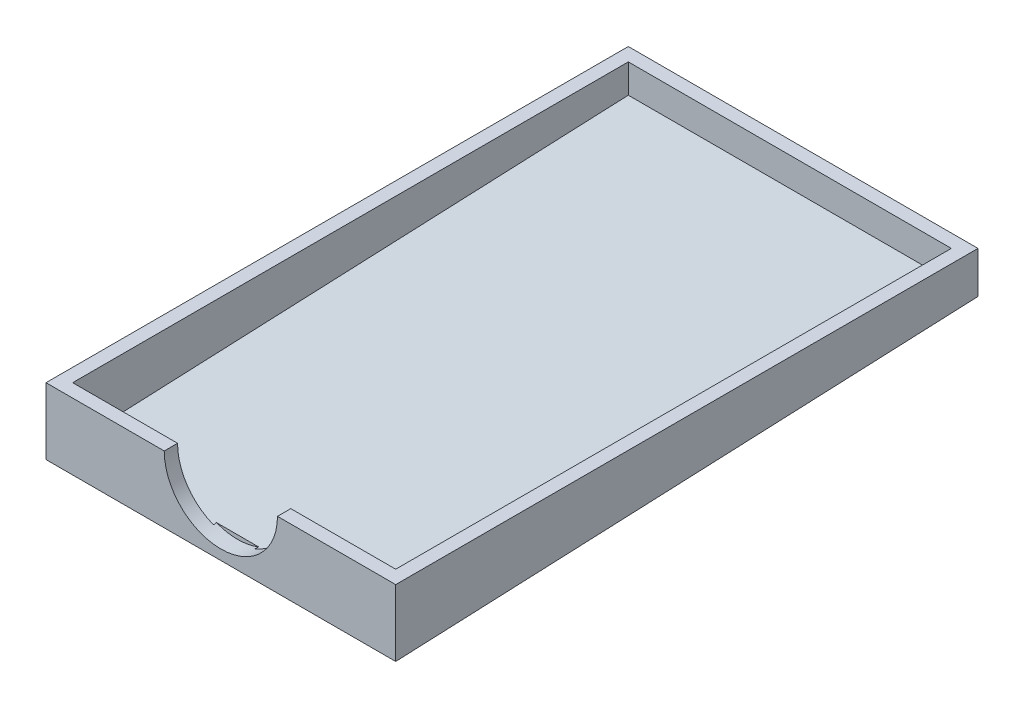
ISO-10303-21;
HEADER;
FILE_DESCRIPTION(('STEP AP214'),'2;1');
FILE_NAME('part.step','',(''),(''),'','','');
FILE_SCHEMA(('AUTOMOTIVE_DESIGN { 1 0 10303 214 1 1 1 1 }'));
ENDSEC;
DATA;
#1=APPLICATION_CONTEXT('core data for automotive mechanical design processes');
#2=APPLICATION_PROTOCOL_DEFINITION('international standard','automotive_design',2000,#1);
#3=PRODUCT_CONTEXT('',#1,'mechanical');
#4=PRODUCT('Part','Part','',(#3));
#5=PRODUCT_RELATED_PRODUCT_CATEGORY('part','',(#4));
#6=PRODUCT_DEFINITION_FORMATION('','',#4);
#7=PRODUCT_DEFINITION_CONTEXT('part definition',#1,'design');
#8=PRODUCT_DEFINITION('design','',#6,#7);
#9=PRODUCT_DEFINITION_SHAPE('','',#8);
#10=(LENGTH_UNIT() NAMED_UNIT(*) SI_UNIT(.MILLI.,.METRE.));
#11=(NAMED_UNIT(*) PLANE_ANGLE_UNIT() SI_UNIT($,.RADIAN.));
#12=(NAMED_UNIT(*) SI_UNIT($,.STERADIAN.) SOLID_ANGLE_UNIT());
#13=UNCERTAINTY_MEASURE_WITH_UNIT(LENGTH_MEASURE(1.E-05),#10,'distance_accuracy_value','');
#14=(GEOMETRIC_REPRESENTATION_CONTEXT(3) GLOBAL_UNCERTAINTY_ASSIGNED_CONTEXT((#13)) GLOBAL_UNIT_ASSIGNED_CONTEXT((#10,
#11,#12)) REPRESENTATION_CONTEXT('',''));
#15=CARTESIAN_POINT('',(0.,0.,0.));
#16=DIRECTION('',(0.,0.,1.));
#17=DIRECTION('',(1.,0.,0.));
#18=AXIS2_PLACEMENT_3D('',#15,#16,#17);
#19=CARTESIAN_POINT('',(21.,-1.5,33.3678423698117));
#20=DIRECTION('',(0.,0.,-1.));
#21=DIRECTION('',(-1.,0.,0.));
#22=AXIS2_PLACEMENT_3D('',#19,#20,#21);
#23=PLANE('',#22);
#24=CARTESIAN_POINT('',(0.,6.5,33.3678423698117));
#25=DIRECTION('',(0.,0.,-1.));
#26=DIRECTION('',(-1.,0.,0.));
#27=AXIS2_PLACEMENT_3D('',#24,#25,#26);
#28=CIRCLE('',#27,6.8);
#29=CARTESIAN_POINT('',(6.80000000000001,6.5,33.3678423698117));
#30=VERTEX_POINT('',#29);
#31=CARTESIAN_POINT('',(2.48443972282158,0.170105904229817,33.3678423698117));
#32=VERTEX_POINT('',#31);
#33=EDGE_CURVE('E239',#30,#32,#28,.T.);
#34=ORIENTED_EDGE('',*,*,#33,.F.);
#35=DIRECTION('',(-1.,0.,0.));
#36=VECTOR('',#35,1.);
#37=CARTESIAN_POINT('',(21.,6.5,33.3678423698117));
#38=LINE('',#37,#36);
#39=CARTESIAN_POINT('',(19.4,6.5,33.3678423698117));
#40=VERTEX_POINT('',#39);
#41=EDGE_CURVE('E203',#40,#30,#38,.T.);
#42=ORIENTED_EDGE('',*,*,#41,.F.);
#43=DIRECTION('',(0.,-1.,0.));
#44=VECTOR('',#43,1.);
#45=CARTESIAN_POINT('',(19.4,0.,33.3678423698117));
#46=LINE('',#45,#44);
#47=CARTESIAN_POINT('',(19.4,0.170105904229817,33.3678423698117));
#48=VERTEX_POINT('',#47);
#49=EDGE_CURVE('E217',#40,#48,#46,.T.);
#50=ORIENTED_EDGE('',*,*,#49,.T.);
#51=DIRECTION('',(-1.,0.,0.));
#52=VECTOR('',#51,1.);
#53=CARTESIAN_POINT('',(21.,0.170105904229817,33.3678423698117));
#54=LINE('',#53,#52);
#55=EDGE_CURVE('E190',#48,#32,#54,.T.);
#56=ORIENTED_EDGE('',*,*,#55,.T.);
#57=EDGE_LOOP('',(#34,#42,#50,#56));
#58=FACE_BOUND('',#57,.T.);
#59=ADVANCED_FACE('F38',(#58),#23,.T.);
#60=CARTESIAN_POINT('',(21.,6.5,34.9678423698117));
#61=DIRECTION('',(0.,-1.,0.));
#62=DIRECTION('',(0.,0.,-1.));
#63=AXIS2_PLACEMENT_3D('',#60,#61,#62);
#64=PLANE('',#63);
#65=ORIENTED_EDGE('',*,*,#41,.T.);
#66=DIRECTION('',(0.,0.,1.));
#67=VECTOR('',#66,1.);
#68=CARTESIAN_POINT('',(6.80000000000001,6.5,32.9678423698117));
#69=LINE('',#68,#67);
#70=CARTESIAN_POINT('',(6.80000000000001,6.5,34.9678423698117));
#71=VERTEX_POINT('',#70);
#72=EDGE_CURVE('E235',#30,#71,#69,.T.);
#73=ORIENTED_EDGE('',*,*,#72,.T.);
#74=DIRECTION('',(-1.,0.,0.));
#75=VECTOR('',#74,1.);
#76=CARTESIAN_POINT('',(21.,6.5,34.9678423698117));
#77=LINE('',#76,#75);
#78=CARTESIAN_POINT('',(21.,6.5,34.9678423698117));
#79=VERTEX_POINT('',#78);
#80=EDGE_CURVE('E157',#79,#71,#77,.T.);
#81=ORIENTED_EDGE('',*,*,#80,.F.);
#82=DIRECTION('',(0.,0.,1.));
#83=VECTOR('',#82,1.);
#84=CARTESIAN_POINT('',(21.,6.5,34.9678423698117));
#85=LINE('',#84,#83);
#86=CARTESIAN_POINT('',(21.,6.49999999999999,-34.9678423698117));
#87=VERTEX_POINT('',#86);
#88=EDGE_CURVE('E164',#87,#79,#85,.T.);
#89=ORIENTED_EDGE('',*,*,#88,.F.);
#90=DIRECTION('',(-1.,0.,0.));
#91=VECTOR('',#90,1.);
#92=CARTESIAN_POINT('',(21.,6.49999999999999,-34.9678423698117));
#93=LINE('',#92,#91);
#94=CARTESIAN_POINT('',(-21.,6.49999999999999,-34.9678423698117));
#95=VERTEX_POINT('',#94);
#96=EDGE_CURVE('E153',#87,#95,#93,.T.);
#97=ORIENTED_EDGE('',*,*,#96,.T.);
#98=DIRECTION('',(0.,0.,1.));
#99=VECTOR('',#98,1.);
#100=CARTESIAN_POINT('',(-21.,6.5,34.9678423698117));
#101=LINE('',#100,#99);
#102=CARTESIAN_POINT('',(-21.,6.5,34.9678423698117));
#103=VERTEX_POINT('',#102);
#104=EDGE_CURVE('E176',#95,#103,#101,.T.);
#105=ORIENTED_EDGE('',*,*,#104,.T.);
#106=CARTESIAN_POINT('',(-6.79999999999999,6.5,34.9678423698117));
#107=VERTEX_POINT('',#106);
#108=EDGE_CURVE('E161',#107,#103,#77,.T.);
#109=ORIENTED_EDGE('',*,*,#108,.F.);
#110=DIRECTION('',(0.,0.,1.));
#111=VECTOR('',#110,1.);
#112=CARTESIAN_POINT('',(-6.79999999999999,6.5,32.9678423698117));
#113=LINE('',#112,#111);
#114=CARTESIAN_POINT('',(-6.79999999999999,6.5,33.3678423698117));
#115=VERTEX_POINT('',#114);
#116=EDGE_CURVE('E242',#107,#115,#113,.F.);
#117=ORIENTED_EDGE('',*,*,#116,.T.);
#118=CARTESIAN_POINT('',(-19.4,6.5,33.3678423698117));
#119=VERTEX_POINT('',#118);
#120=EDGE_CURVE('E207',#115,#119,#38,.T.);
#121=ORIENTED_EDGE('',*,*,#120,.T.);
#122=DIRECTION('',(0.,0.,1.));
#123=VECTOR('',#122,1.);
#124=CARTESIAN_POINT('',(-19.4,6.5,0.));
#125=LINE('',#124,#123);
#126=CARTESIAN_POINT('',(-19.4,6.49999999999999,-33.3678423698117));
#127=VERTEX_POINT('',#126);
#128=EDGE_CURVE('E221',#127,#119,#125,.T.);
#129=ORIENTED_EDGE('',*,*,#128,.F.);
#130=DIRECTION('',(-1.,0.,0.));
#131=VECTOR('',#130,1.);
#132=CARTESIAN_POINT('',(21.,6.49999999999999,-33.3678423698117));
#133=LINE('',#132,#131);
#134=CARTESIAN_POINT('',(19.4,6.49999999999999,-33.3678423698117));
#135=VERTEX_POINT('',#134);
#136=EDGE_CURVE('E199',#135,#127,#133,.T.);
#137=ORIENTED_EDGE('',*,*,#136,.F.);
#138=DIRECTION('',(0.,0.,1.));
#139=VECTOR('',#138,1.);
#140=CARTESIAN_POINT('',(19.4,6.5,0.));
#141=LINE('',#140,#139);
#142=EDGE_CURVE('E60',#135,#40,#141,.T.);
#143=ORIENTED_EDGE('',*,*,#142,.T.);
#144=EDGE_LOOP('',(#65,#73,#81,#89,#97,#105,#109,#117,#121,#129,#137,#143));
#145=FACE_BOUND('',#144,.T.);
#146=ADVANCED_FACE('F255',(#145),#64,.F.);
#147=CARTESIAN_POINT('',(21.,-1.5,34.9678423698117));
#148=DIRECTION('',(0.,0.,-1.));
#149=DIRECTION('',(-1.,0.,0.));
#150=AXIS2_PLACEMENT_3D('',#147,#148,#149);
#151=PLANE('',#150);
#152=ORIENTED_EDGE('',*,*,#80,.T.);
#153=CARTESIAN_POINT('',(0.,6.5,34.9678423698117));
#154=DIRECTION('',(0.,0.,1.));
#155=DIRECTION('',(1.,0.,0.));
#156=AXIS2_PLACEMENT_3D('',#153,#154,#155);
#157=CIRCLE('',#156,6.8);
#158=EDGE_CURVE('E139',#107,#71,#157,.T.);
#159=ORIENTED_EDGE('',*,*,#158,.F.);
#160=ORIENTED_EDGE('',*,*,#108,.T.);
#161=DIRECTION('',(0.,-1.,0.));
#162=VECTOR('',#161,1.);
#163=CARTESIAN_POINT('',(-21.,-1.5,34.9678423698117));
#164=LINE('',#163,#162);
#165=CARTESIAN_POINT('',(-21.,-1.5,34.9678423698117));
#166=VERTEX_POINT('',#165);
#167=EDGE_CURVE('E186',#103,#166,#164,.T.);
#168=ORIENTED_EDGE('',*,*,#167,.T.);
#169=DIRECTION('',(-1.,0.,0.));
#170=VECTOR('',#169,1.);
#171=CARTESIAN_POINT('',(21.,-1.5,34.9678423698117));
#172=LINE('',#171,#170);
#173=CARTESIAN_POINT('',(21.,-1.5,34.9678423698117));
#174=VERTEX_POINT('',#173);
#175=EDGE_CURVE('E133',#174,#166,#172,.T.);
#176=ORIENTED_EDGE('',*,*,#175,.F.);
#177=DIRECTION('',(0.,-1.,0.));
#178=VECTOR('',#177,1.);
#179=CARTESIAN_POINT('',(21.,-1.5,34.9678423698117));
#180=LINE('',#179,#178);
#181=EDGE_CURVE('E172',#79,#174,#180,.T.);
#182=ORIENTED_EDGE('',*,*,#181,.F.);
#183=EDGE_LOOP('',(#152,#159,#160,#168,#176,#182));
#184=FACE_BOUND('',#183,.T.);
#185=ADVANCED_FACE('F40',(#184),#151,.F.);
#186=CARTESIAN_POINT('',(21.,-1.5,34.9678423698117));
#187=DIRECTION('',(0.,0.999081210566049,0.0428571428571427));
#188=DIRECTION('',(0.,-0.0428571428571427,0.999081210566049));
#189=AXIS2_PLACEMENT_3D('',#186,#187,#188);
#190=PLANE('',#189);
#191=DIRECTION('',(0.,0.0428571428571427,-0.999081210566049));
#192=VECTOR('',#191,1.);
#193=CARTESIAN_POINT('',(-21.,-1.5,34.9678423698117));
#194=LINE('',#193,#192);
#195=CARTESIAN_POINT('',(-21.,1.49999999999999,-34.9678423698117));
#196=VERTEX_POINT('',#195);
#197=EDGE_CURVE('E183',#166,#196,#194,.T.);
#198=ORIENTED_EDGE('',*,*,#197,.T.);
#199=DIRECTION('',(-1.,0.,0.));
#200=VECTOR('',#199,1.);
#201=CARTESIAN_POINT('',(21.,1.49999999999999,-34.9678423698117));
#202=LINE('',#201,#200);
#203=CARTESIAN_POINT('',(21.,1.49999999999999,-34.9678423698117));
#204=VERTEX_POINT('',#203);
#205=EDGE_CURVE('E149',#204,#196,#202,.T.);
#206=ORIENTED_EDGE('',*,*,#205,.F.);
#207=DIRECTION('',(0.,0.0428571428571427,-0.999081210566049));
#208=VECTOR('',#207,1.);
#209=CARTESIAN_POINT('',(21.,-1.5,34.9678423698117));
#210=LINE('',#209,#208);
#211=EDGE_CURVE('E169',#174,#204,#210,.T.);
#212=ORIENTED_EDGE('',*,*,#211,.F.);
#213=ORIENTED_EDGE('',*,*,#175,.T.);
#214=EDGE_LOOP('',(#198,#206,#212,#213));
#215=FACE_BOUND('',#214,.T.);
#216=ADVANCED_FACE('F309',(#215),#190,.F.);
#217=CARTESIAN_POINT('',(21.,6.49999999999999,-34.9678423698117));
#218=DIRECTION('',(0.,0.,1.));
#219=DIRECTION('',(1.,0.,0.));
#220=AXIS2_PLACEMENT_3D('',#217,#218,#219);
#221=PLANE('',#220);
#222=DIRECTION('',(0.,1.,0.));
#223=VECTOR('',#222,1.);
#224=CARTESIAN_POINT('',(-21.,6.49999999999999,-34.9678423698117));
#225=LINE('',#224,#223);
#226=EDGE_CURVE('E180',#196,#95,#225,.T.);
#227=ORIENTED_EDGE('',*,*,#226,.T.);
#228=ORIENTED_EDGE('',*,*,#96,.F.);
#229=DIRECTION('',(0.,1.,0.));
#230=VECTOR('',#229,1.);
#231=CARTESIAN_POINT('',(21.,6.49999999999999,-34.9678423698117));
#232=LINE('',#231,#230);
#233=EDGE_CURVE('E166',#204,#87,#232,.T.);
#234=ORIENTED_EDGE('',*,*,#233,.F.);
#235=ORIENTED_EDGE('',*,*,#205,.T.);
#236=EDGE_LOOP('',(#227,#228,#234,#235));
#237=FACE_BOUND('',#236,.T.);
#238=ADVANCED_FACE('F304',(#237),#221,.F.);
#239=CARTESIAN_POINT('',(21.,0.,0.));
#240=DIRECTION('',(-1.,0.,0.));
#241=DIRECTION('',(0.,0.,1.));
#242=AXIS2_PLACEMENT_3D('',#239,#240,#241);
#243=PLANE('',#242);
#244=ORIENTED_EDGE('',*,*,#181,.T.);
#245=ORIENTED_EDGE('',*,*,#211,.T.);
#246=ORIENTED_EDGE('',*,*,#233,.T.);
#247=ORIENTED_EDGE('',*,*,#88,.T.);
#248=EDGE_LOOP('',(#244,#245,#246,#247));
#249=FACE_BOUND('',#248,.T.);
#250=ADVANCED_FACE('F260',(#249),#243,.F.);
#251=CARTESIAN_POINT('',(-21.,0.,0.));
#252=DIRECTION('',(-1.,0.,0.));
#253=DIRECTION('',(0.,0.,1.));
#254=AXIS2_PLACEMENT_3D('',#251,#252,#253);
#255=PLANE('',#254);
#256=ORIENTED_EDGE('',*,*,#167,.F.);
#257=ORIENTED_EDGE('',*,*,#104,.F.);
#258=ORIENTED_EDGE('',*,*,#226,.F.);
#259=ORIENTED_EDGE('',*,*,#197,.F.);
#260=EDGE_LOOP('',(#256,#257,#258,#259));
#261=FACE_BOUND('',#260,.T.);
#262=ADVANCED_FACE('F269',(#261),#255,.T.);
#263=CARTESIAN_POINT('',(-2.48443972282156,0.170105904229817,33.3678423698117));
#264=VERTEX_POINT('',#263);
#265=EDGE_CURVE('E138',#264,#115,#28,.T.);
#266=ORIENTED_EDGE('',*,*,#265,.F.);
#267=CARTESIAN_POINT('',(-19.4,0.170105904229817,33.3678423698117));
#268=VERTEX_POINT('',#267);
#269=EDGE_CURVE('E144',#264,#268,#54,.T.);
#270=ORIENTED_EDGE('',*,*,#269,.T.);
#271=DIRECTION('',(0.,-1.,0.));
#272=VECTOR('',#271,1.);
#273=CARTESIAN_POINT('',(-19.4,0.,33.3678423698117));
#274=LINE('',#273,#272);
#275=EDGE_CURVE('E231',#119,#268,#274,.T.);
#276=ORIENTED_EDGE('',*,*,#275,.F.);
#277=ORIENTED_EDGE('',*,*,#120,.F.);
#278=EDGE_LOOP('',(#266,#270,#276,#277));
#279=FACE_BOUND('',#278,.T.);
#280=ADVANCED_FACE('F274',(#279),#23,.T.);
#281=CARTESIAN_POINT('',(21.,0.0985299369056819,35.0364137983832));
#282=DIRECTION('',(0.,0.999081210566049,0.0428571428571427));
#283=DIRECTION('',(0.,-0.0428571428571427,0.999081210566049));
#284=AXIS2_PLACEMENT_3D('',#281,#282,#283);
#285=PLANE('',#284);
#286=CARTESIAN_POINT('',(0.,6.5,-114.193983602518));
#287=DIRECTION('',(0.,0.999081210566049,0.0428571428571427));
#288=DIRECTION('',(0.,-0.0428571428571427,0.999081210566049));
#289=AXIS2_PLACEMENT_3D('',#286,#287,#288);
#290=ELLIPSE('',#289,158.666666666667,6.8);
#291=CARTESIAN_POINT('',(2.52772048336802,0.187264526533548,32.9678423698117));
#292=VERTEX_POINT('',#291);
#293=EDGE_CURVE('E11',#32,#292,#290,.T.);
#294=ORIENTED_EDGE('',*,*,#293,.F.);
#295=ORIENTED_EDGE('',*,*,#55,.F.);
#296=DIRECTION('',(0.,0.0428571428571427,-0.999081210566049));
#297=VECTOR('',#296,1.);
#298=CARTESIAN_POINT('',(19.4,1.59852993690568,0.0685714285714282));
#299=LINE('',#298,#297);
#300=CARTESIAN_POINT('',(19.4,3.03283692579996,-33.3678423698117));
#301=VERTEX_POINT('',#300);
#302=EDGE_CURVE('E214',#48,#301,#299,.T.);
#303=ORIENTED_EDGE('',*,*,#302,.T.);
#304=DIRECTION('',(-1.,0.,0.));
#305=VECTOR('',#304,1.);
#306=CARTESIAN_POINT('',(21.,3.03283692579996,-33.3678423698117));
#307=LINE('',#306,#305);
#308=CARTESIAN_POINT('',(-19.4,3.03283692579996,-33.3678423698117));
#309=VERTEX_POINT('',#308);
#310=EDGE_CURVE('E196',#301,#309,#307,.T.);
#311=ORIENTED_EDGE('',*,*,#310,.T.);
#312=DIRECTION('',(0.,0.0428571428571427,-0.999081210566049));
#313=VECTOR('',#312,1.);
#314=CARTESIAN_POINT('',(-19.4,1.59852993690568,0.0685714285714282));
#315=LINE('',#314,#313);
#316=EDGE_CURVE('E228',#268,#309,#315,.T.);
#317=ORIENTED_EDGE('',*,*,#316,.F.);
#318=ORIENTED_EDGE('',*,*,#269,.F.);
#319=CARTESIAN_POINT('',(-2.52772048336801,0.187264526533548,32.9678423698117));
#320=VERTEX_POINT('',#319);
#321=EDGE_CURVE('E42',#320,#264,#290,.T.);
#322=ORIENTED_EDGE('',*,*,#321,.F.);
#323=DIRECTION('',(1.,0.,0.));
#324=VECTOR('',#323,1.);
#325=CARTESIAN_POINT('',(21.,0.187264526533548,32.9678423698117));
#326=LINE('',#325,#324);
#327=EDGE_CURVE('E127',#320,#292,#326,.T.);
#328=ORIENTED_EDGE('',*,*,#327,.T.);
#329=EDGE_LOOP('',(#294,#295,#303,#311,#317,#318,#322,#328));
#330=FACE_BOUND('',#329,.T.);
#331=ADVANCED_FACE('F142',(#330),#285,.T.);
#332=CARTESIAN_POINT('',(21.,6.49999999999999,-33.3678423698117));
#333=DIRECTION('',(0.,0.,1.));
#334=DIRECTION('',(1.,0.,0.));
#335=AXIS2_PLACEMENT_3D('',#332,#333,#334);
#336=PLANE('',#335);
#337=DIRECTION('',(0.,1.,0.));
#338=VECTOR('',#337,1.);
#339=CARTESIAN_POINT('',(-19.4,0.,-33.3678423698117));
#340=LINE('',#339,#338);
#341=EDGE_CURVE('E225',#309,#127,#340,.T.);
#342=ORIENTED_EDGE('',*,*,#341,.F.);
#343=ORIENTED_EDGE('',*,*,#310,.F.);
#344=DIRECTION('',(0.,1.,0.));
#345=VECTOR('',#344,1.);
#346=CARTESIAN_POINT('',(19.4,0.,-33.3678423698117));
#347=LINE('',#346,#345);
#348=EDGE_CURVE('E211',#301,#135,#347,.T.);
#349=ORIENTED_EDGE('',*,*,#348,.T.);
#350=ORIENTED_EDGE('',*,*,#136,.T.);
#351=EDGE_LOOP('',(#342,#343,#349,#350));
#352=FACE_BOUND('',#351,.T.);
#353=ADVANCED_FACE('F280',(#352),#336,.T.);
#354=CARTESIAN_POINT('',(19.4,0.,0.));
#355=DIRECTION('',(-1.,0.,0.));
#356=DIRECTION('',(0.,0.,1.));
#357=AXIS2_PLACEMENT_3D('',#354,#355,#356);
#358=PLANE('',#357);
#359=ORIENTED_EDGE('',*,*,#49,.F.);
#360=ORIENTED_EDGE('',*,*,#142,.F.);
#361=ORIENTED_EDGE('',*,*,#348,.F.);
#362=ORIENTED_EDGE('',*,*,#302,.F.);
#363=EDGE_LOOP('',(#359,#360,#361,#362));
#364=FACE_BOUND('',#363,.T.);
#365=ADVANCED_FACE('F282',(#364),#358,.T.);
#366=CARTESIAN_POINT('',(-19.4,0.,0.));
#367=DIRECTION('',(-1.,0.,0.));
#368=DIRECTION('',(0.,0.,1.));
#369=AXIS2_PLACEMENT_3D('',#366,#367,#368);
#370=PLANE('',#369);
#371=ORIENTED_EDGE('',*,*,#275,.T.);
#372=ORIENTED_EDGE('',*,*,#316,.T.);
#373=ORIENTED_EDGE('',*,*,#341,.T.);
#374=ORIENTED_EDGE('',*,*,#128,.T.);
#375=EDGE_LOOP('',(#371,#372,#373,#374));
#376=FACE_BOUND('',#375,.T.);
#377=ADVANCED_FACE('F276',(#376),#370,.F.);
#378=CARTESIAN_POINT('',(0.,6.5,32.9678423698117));
#379=DIRECTION('',(0.,0.,1.));
#380=DIRECTION('',(1.,0.,0.));
#381=AXIS2_PLACEMENT_3D('',#378,#379,#380);
#382=CYLINDRICAL_SURFACE('',#381,6.8);
#383=ORIENTED_EDGE('',*,*,#33,.T.);
#384=ORIENTED_EDGE('',*,*,#293,.T.);
#385=CARTESIAN_POINT('',(0.,6.5,32.9678423698117));
#386=DIRECTION('',(0.,0.,1.));
#387=DIRECTION('',(1.,0.,0.));
#388=AXIS2_PLACEMENT_3D('',#385,#386,#387);
#389=CIRCLE('',#388,6.8);
#390=EDGE_CURVE('E53',#320,#292,#389,.T.);
#391=ORIENTED_EDGE('',*,*,#390,.F.);
#392=ORIENTED_EDGE('',*,*,#321,.T.);
#393=ORIENTED_EDGE('',*,*,#265,.T.);
#394=ORIENTED_EDGE('',*,*,#116,.F.);
#395=ORIENTED_EDGE('',*,*,#158,.T.);
#396=ORIENTED_EDGE('',*,*,#72,.F.);
#397=EDGE_LOOP('',(#383,#384,#391,#392,#393,#394,#395,#396));
#398=FACE_BOUND('',#397,.T.);
#399=ADVANCED_FACE('F135',(#398),#382,.F.);
#400=CARTESIAN_POINT('',(0.,6.5,32.9678423698117));
#401=DIRECTION('',(0.,0.,1.));
#402=DIRECTION('',(1.,0.,0.));
#403=AXIS2_PLACEMENT_3D('',#400,#401,#402);
#404=PLANE('',#403);
#405=ORIENTED_EDGE('',*,*,#390,.T.);
#406=ORIENTED_EDGE('',*,*,#327,.F.);
#407=EDGE_LOOP('',(#405,#406));
#408=FACE_BOUND('',#407,.T.);
#409=ADVANCED_FACE('F128',(#408),#404,.T.);
#410=CLOSED_SHELL('',(#59,#146,#185,#216,#238,#250,#262,#280,#331,#353,#365,#377,#399,#409));
#411=MANIFOLD_SOLID_BREP('B2',#410);
#412=ADVANCED_BREP_SHAPE_REPRESENTATION('',(#18,#411),#14);
#413=SHAPE_DEFINITION_REPRESENTATION(#9,#412);
ENDSEC;
END-ISO-10303-21;
